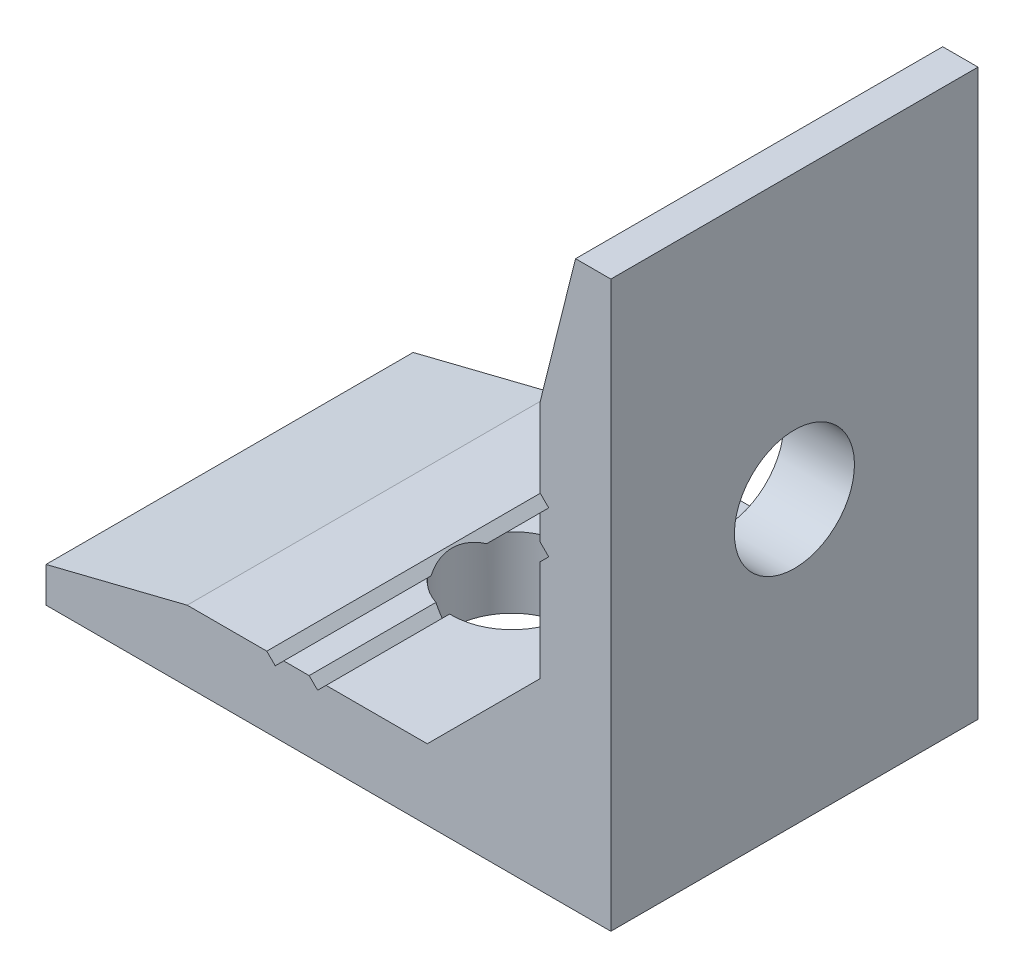
ISO-10303-21;
HEADER;
FILE_DESCRIPTION(('STEP AP214'),'2;1');
FILE_NAME('part.step','',(''),(''),'','','');
FILE_SCHEMA(('AUTOMOTIVE_DESIGN { 1 0 10303 214 1 1 1 1 }'));
ENDSEC;
DATA;
#1=APPLICATION_CONTEXT('core data for automotive mechanical design processes');
#2=APPLICATION_PROTOCOL_DEFINITION('international standard','automotive_design',2000,#1);
#3=PRODUCT_CONTEXT('',#1,'mechanical');
#4=PRODUCT('Part','Part','',(#3));
#5=PRODUCT_RELATED_PRODUCT_CATEGORY('part','',(#4));
#6=PRODUCT_DEFINITION_FORMATION('','',#4);
#7=PRODUCT_DEFINITION_CONTEXT('part definition',#1,'design');
#8=PRODUCT_DEFINITION('design','',#6,#7);
#9=PRODUCT_DEFINITION_SHAPE('','',#8);
#10=(LENGTH_UNIT() NAMED_UNIT(*) SI_UNIT(.MILLI.,.METRE.));
#11=(NAMED_UNIT(*) PLANE_ANGLE_UNIT() SI_UNIT($,.RADIAN.));
#12=(NAMED_UNIT(*) SI_UNIT($,.STERADIAN.) SOLID_ANGLE_UNIT());
#13=UNCERTAINTY_MEASURE_WITH_UNIT(LENGTH_MEASURE(1.E-05),#10,'distance_accuracy_value','');
#14=(GEOMETRIC_REPRESENTATION_CONTEXT(3) GLOBAL_UNCERTAINTY_ASSIGNED_CONTEXT((#13)) GLOBAL_UNIT_ASSIGNED_CONTEXT((#10,
#11,#12)) REPRESENTATION_CONTEXT('',''));
#15=CARTESIAN_POINT('',(0.,0.,0.));
#16=DIRECTION('',(0.,0.,1.));
#17=DIRECTION('',(1.,0.,0.));
#18=AXIS2_PLACEMENT_3D('',#15,#16,#17);
#19=CARTESIAN_POINT('',(35.599999999999,23.7649508334723,13.));
#20=DIRECTION('',(0.707106781186548,-0.707106781186548,0.));
#21=DIRECTION('',(0.707106781186548,0.707106781186548,0.));
#22=AXIS2_PLACEMENT_3D('',#19,#20,#21);
#23=PLANE('',#22);
#24=DIRECTION('',(0.,0.,-1.));
#25=VECTOR('',#24,1.);
#26=CARTESIAN_POINT('',(35.,23.1649508334733,13.));
#27=LINE('',#26,#25);
#28=CARTESIAN_POINT('',(35.0000000000001,23.1649508334733,-2.83647425895196));
#29=VERTEX_POINT('',#28);
#30=CARTESIAN_POINT('',(35.,23.1649508334733,-13.));
#31=VERTEX_POINT('',#30);
#32=EDGE_CURVE('E268',#29,#31,#27,.T.);
#33=ORIENTED_EDGE('',*,*,#32,.F.);
#34=CARTESIAN_POINT('',(31.8350491665269,20.0000000000002,0.));
#35=DIRECTION('',(0.707106781186548,-0.707106781186548,0.));
#36=DIRECTION('',(-0.707106781186548,-0.707106781186548,0.));
#37=AXIS2_PLACEMENT_3D('',#34,#35,#36);
#38=ELLIPSE('',#37,6.01040764008546,4.25);
#39=CARTESIAN_POINT('',(35.599999999999,23.7649508334723,-1.97171124192581));
#40=VERTEX_POINT('',#39);
#41=EDGE_CURVE('E546',#29,#40,#38,.T.);
#42=ORIENTED_EDGE('',*,*,#41,.T.);
#43=DIRECTION('',(0.,0.,-1.));
#44=VECTOR('',#43,1.);
#45=CARTESIAN_POINT('',(35.599999999999,23.7649508334723,13.));
#46=LINE('',#45,#44);
#47=CARTESIAN_POINT('',(35.599999999999,23.7649508334723,-13.));
#48=VERTEX_POINT('',#47);
#49=EDGE_CURVE('E272',#40,#48,#46,.T.);
#50=ORIENTED_EDGE('',*,*,#49,.T.);
#51=DIRECTION('',(-0.707106781186548,-0.707106781186548,0.));
#52=VECTOR('',#51,1.);
#53=CARTESIAN_POINT('',(35.599999999999,23.7649508334723,-13.));
#54=LINE('',#53,#52);
#55=EDGE_CURVE('E416',#48,#31,#54,.T.);
#56=ORIENTED_EDGE('',*,*,#55,.T.);
#57=EDGE_LOOP('',(#33,#42,#50,#56));
#58=FACE_BOUND('',#57,.T.);
#59=ADVANCED_FACE('F35',(#58),#23,.F.);
#60=CARTESIAN_POINT('',(34.9999999999998,21.3649508334714,13.));
#61=DIRECTION('',(1.,-1.27213054904832E-13,0.));
#62=DIRECTION('',(1.27213054904832E-13,1.,0.));
#63=AXIS2_PLACEMENT_3D('',#60,#61,#62);
#64=PLANE('',#63);
#65=CARTESIAN_POINT('',(35.,23.1649508334733,13.));
#66=VERTEX_POINT('',#65);
#67=CARTESIAN_POINT('',(35.0000000000001,23.1649508334733,2.83647425895197));
#68=VERTEX_POINT('',#67);
#69=EDGE_CURVE('E269',#66,#68,#27,.T.);
#70=ORIENTED_EDGE('',*,*,#69,.T.);
#71=CARTESIAN_POINT('',(35.,20.0000000000001,0.));
#72=DIRECTION('',(-1.,0.,0.));
#73=DIRECTION('',(0.,-1.,0.));
#74=AXIS2_PLACEMENT_3D('',#71,#72,#73);
#75=CIRCLE('',#74,4.25);
#76=CARTESIAN_POINT('',(35.0000000000001,21.3649508334712,4.0248489688691));
#77=VERTEX_POINT('',#76);
#78=EDGE_CURVE('E629',#77,#68,#75,.T.);
#79=ORIENTED_EDGE('',*,*,#78,.F.);
#80=DIRECTION('',(0.,0.,-1.));
#81=VECTOR('',#80,1.);
#82=CARTESIAN_POINT('',(34.9999999999998,21.3649508334714,13.));
#83=LINE('',#82,#81);
#84=CARTESIAN_POINT('',(34.9999999999998,21.3649508334714,13.));
#85=VERTEX_POINT('',#84);
#86=EDGE_CURVE('E265',#85,#77,#83,.T.);
#87=ORIENTED_EDGE('',*,*,#86,.F.);
#88=DIRECTION('',(-1.27213054904832E-13,-1.,0.));
#89=VECTOR('',#88,1.);
#90=CARTESIAN_POINT('',(34.9999999999998,21.3649508334714,13.));
#91=LINE('',#90,#89);
#92=EDGE_CURVE('E492',#66,#85,#91,.T.);
#93=ORIENTED_EDGE('',*,*,#92,.F.);
#94=EDGE_LOOP('',(#70,#79,#87,#93));
#95=FACE_BOUND('',#94,.T.);
#96=ADVANCED_FACE('F525',(#95),#64,.F.);
#97=CARTESIAN_POINT('',(35.5999999999993,20.7649508334723,13.));
#98=DIRECTION('',(0.707106781186345,0.70710678118675,0.));
#99=DIRECTION('',(-0.70710678118675,0.707106781186345,0.));
#100=AXIS2_PLACEMENT_3D('',#97,#98,#99);
#101=PLANE('',#100);
#102=ORIENTED_EDGE('',*,*,#86,.T.);
#103=CARTESIAN_POINT('',(36.364950833472,20.,0.));
#104=DIRECTION('',(0.707106781186345,0.70710678118675,0.));
#105=DIRECTION('',(-0.70710678118675,0.707106781186345,0.));
#106=AXIS2_PLACEMENT_3D('',#103,#104,#105);
#107=ELLIPSE('',#106,6.01040764008757,4.25);
#108=CARTESIAN_POINT('',(35.5999999999993,20.7649508334723,4.18059208992819));
#109=VERTEX_POINT('',#108);
#110=EDGE_CURVE('E250',#77,#109,#107,.T.);
#111=ORIENTED_EDGE('',*,*,#110,.T.);
#112=DIRECTION('',(0.,0.,-1.));
#113=VECTOR('',#112,1.);
#114=CARTESIAN_POINT('',(35.5999999999993,20.7649508334723,13.));
#115=LINE('',#114,#113);
#116=CARTESIAN_POINT('',(35.5999999999993,20.7649508334723,13.));
#117=VERTEX_POINT('',#116);
#118=EDGE_CURVE('E249',#117,#109,#115,.T.);
#119=ORIENTED_EDGE('',*,*,#118,.F.);
#120=DIRECTION('',(0.70710678118675,-0.707106781186345,0.));
#121=VECTOR('',#120,1.);
#122=CARTESIAN_POINT('',(35.5999999999993,20.7649508334723,13.));
#123=LINE('',#122,#121);
#124=EDGE_CURVE('E494',#85,#117,#123,.T.);
#125=ORIENTED_EDGE('',*,*,#124,.F.);
#126=EDGE_LOOP('',(#102,#111,#119,#125));
#127=FACE_BOUND('',#126,.T.);
#128=ADVANCED_FACE('F531',(#127),#101,.F.);
#129=CARTESIAN_POINT('',(35.5999999999993,20.7649508334723,13.));
#130=DIRECTION('',(0.707106781186615,-0.70710678118648,0.));
#131=DIRECTION('',(0.70710678118648,0.707106781186615,0.));
#132=AXIS2_PLACEMENT_3D('',#129,#130,#131);
#133=PLANE('',#132);
#134=DIRECTION('',(0.,0.,-1.));
#135=VECTOR('',#134,1.);
#136=CARTESIAN_POINT('',(35.,20.164950833473,13.));
#137=LINE('',#136,#135);
#138=CARTESIAN_POINT('',(35.,20.164950833473,-4.24679776096491));
#139=VERTEX_POINT('',#138);
#140=CARTESIAN_POINT('',(35.,20.164950833473,-13.));
#141=VERTEX_POINT('',#140);
#142=EDGE_CURVE('E257',#139,#141,#137,.T.);
#143=ORIENTED_EDGE('',*,*,#142,.F.);
#144=CARTESIAN_POINT('',(34.8350491665272,20.0000000000001,0.));
#145=DIRECTION('',(0.707106781186615,-0.70710678118648,0.));
#146=DIRECTION('',(-0.70710678118648,-0.707106781186615,0.));
#147=AXIS2_PLACEMENT_3D('',#144,#145,#146);
#148=ELLIPSE('',#147,6.01040764008489,4.25);
#149=CARTESIAN_POINT('',(35.5999999999993,20.7649508334723,-4.18059208992818));
#150=VERTEX_POINT('',#149);
#151=EDGE_CURVE('E50',#139,#150,#148,.T.);
#152=ORIENTED_EDGE('',*,*,#151,.T.);
#153=CARTESIAN_POINT('',(35.5999999999993,20.7649508334723,-13.));
#154=VERTEX_POINT('',#153);
#155=EDGE_CURVE('E256',#150,#154,#115,.T.);
#156=ORIENTED_EDGE('',*,*,#155,.T.);
#157=DIRECTION('',(-0.70710678118648,-0.707106781186615,0.));
#158=VECTOR('',#157,1.);
#159=CARTESIAN_POINT('',(35.5999999999993,20.7649508334723,-13.));
#160=LINE('',#159,#158);
#161=EDGE_CURVE('E356',#154,#141,#160,.T.);
#162=ORIENTED_EDGE('',*,*,#161,.T.);
#163=EDGE_LOOP('',(#143,#152,#156,#162));
#164=FACE_BOUND('',#163,.T.);
#165=ADVANCED_FACE('F426',(#164),#133,.F.);
#166=CARTESIAN_POINT('',(19.2350491665275,4.39999999999998,13.));
#167=DIRECTION('',(0.707106781186479,-0.707106781186616,0.));
#168=DIRECTION('',(0.707106781186616,0.707106781186479,0.));
#169=AXIS2_PLACEMENT_3D('',#166,#167,#168);
#170=PLANE('',#169);
#171=DIRECTION('',(0.,0.,-1.));
#172=VECTOR('',#171,1.);
#173=CARTESIAN_POINT('',(19.8350491665276,5.,13.));
#174=LINE('',#173,#172);
#175=CARTESIAN_POINT('',(19.8350491665276,5.,13.));
#176=VERTEX_POINT('',#175);
#177=CARTESIAN_POINT('',(19.8350491665276,5.,4.24679776096494));
#178=VERTEX_POINT('',#177);
#179=EDGE_CURVE('E329',#176,#178,#174,.T.);
#180=ORIENTED_EDGE('',*,*,#179,.T.);
#181=CARTESIAN_POINT('',(20.,5.16495083347237,0.));
#182=DIRECTION('',(0.707106781186479,-0.707106781186616,0.));
#183=DIRECTION('',(0.707106781186616,0.707106781186479,0.));
#184=AXIS2_PLACEMENT_3D('',#181,#182,#183);
#185=ELLIPSE('',#184,6.01040764008507,4.25);
#186=CARTESIAN_POINT('',(19.2350491665275,4.39999999999998,4.18059208992814));
#187=VERTEX_POINT('',#186);
#188=EDGE_CURVE('E402',#178,#187,#185,.T.);
#189=ORIENTED_EDGE('',*,*,#188,.T.);
#190=DIRECTION('',(0.,0.,-1.));
#191=VECTOR('',#190,1.);
#192=CARTESIAN_POINT('',(19.2350491665275,4.39999999999998,13.));
#193=LINE('',#192,#191);
#194=CARTESIAN_POINT('',(19.2350491665275,4.39999999999998,13.));
#195=VERTEX_POINT('',#194);
#196=EDGE_CURVE('E325',#195,#187,#193,.T.);
#197=ORIENTED_EDGE('',*,*,#196,.F.);
#198=DIRECTION('',(-0.707106781186616,-0.707106781186479,0.));
#199=VECTOR('',#198,1.);
#200=CARTESIAN_POINT('',(19.2350491665275,4.39999999999998,13.));
#201=LINE('',#200,#199);
#202=EDGE_CURVE('E502',#176,#195,#201,.T.);
#203=ORIENTED_EDGE('',*,*,#202,.F.);
#204=EDGE_LOOP('',(#180,#189,#197,#203));
#205=FACE_BOUND('',#204,.T.);
#206=ADVANCED_FACE('F599',(#205),#170,.F.);
#207=CARTESIAN_POINT('',(19.2350491665275,4.39999999999998,13.));
#208=DIRECTION('',(-0.707106781186481,-0.707106781186614,0.));
#209=DIRECTION('',(0.707106781186614,-0.707106781186481,0.));
#210=AXIS2_PLACEMENT_3D('',#207,#208,#209);
#211=PLANE('',#210);
#212=DIRECTION('',(0.,0.,-1.));
#213=VECTOR('',#212,1.);
#214=CARTESIAN_POINT('',(18.6350491665274,5.,13.));
#215=LINE('',#214,#213);
#216=CARTESIAN_POINT('',(18.6350491665274,5.,-4.02484896886855));
#217=VERTEX_POINT('',#216);
#218=CARTESIAN_POINT('',(18.6350491665274,5.,-13.));
#219=VERTEX_POINT('',#218);
#220=EDGE_CURVE('E320',#217,#219,#215,.T.);
#221=ORIENTED_EDGE('',*,*,#220,.F.);
#222=CARTESIAN_POINT('',(20.,3.63504916652758,0.));
#223=DIRECTION('',(-0.707106781186481,-0.707106781186614,0.));
#224=DIRECTION('',(-0.707106781186614,0.707106781186481,0.));
#225=AXIS2_PLACEMENT_3D('',#222,#223,#224);
#226=ELLIPSE('',#225,6.01040764008509,4.25);
#227=CARTESIAN_POINT('',(19.2350491665275,4.39999999999998,-4.18059208992813));
#228=VERTEX_POINT('',#227);
#229=EDGE_CURVE('E400',#217,#228,#226,.T.);
#230=ORIENTED_EDGE('',*,*,#229,.T.);
#231=CARTESIAN_POINT('',(19.2350491665275,4.39999999999998,-13.));
#232=VERTEX_POINT('',#231);
#233=EDGE_CURVE('E324',#228,#232,#193,.T.);
#234=ORIENTED_EDGE('',*,*,#233,.T.);
#235=DIRECTION('',(-0.707106781186614,0.707106781186481,0.));
#236=VECTOR('',#235,1.);
#237=CARTESIAN_POINT('',(19.2350491665275,4.39999999999998,-13.));
#238=LINE('',#237,#236);
#239=EDGE_CURVE('E362',#232,#219,#238,.T.);
#240=ORIENTED_EDGE('',*,*,#239,.T.);
#241=EDGE_LOOP('',(#221,#230,#234,#240));
#242=FACE_BOUND('',#241,.T.);
#243=ADVANCED_FACE('F568',(#242),#211,.F.);
#244=CARTESIAN_POINT('',(16.8350491665274,5.,13.));
#245=DIRECTION('',(0.,-1.,0.));
#246=DIRECTION('',(0.,0.,-1.));
#247=AXIS2_PLACEMENT_3D('',#244,#245,#246);
#248=PLANE('',#247);
#249=CARTESIAN_POINT('',(18.6350491665274,5.,13.));
#250=VERTEX_POINT('',#249);
#251=CARTESIAN_POINT('',(18.6350491665274,5.,4.02484896886856));
#252=VERTEX_POINT('',#251);
#253=EDGE_CURVE('E321',#250,#252,#215,.T.);
#254=ORIENTED_EDGE('',*,*,#253,.T.);
#255=CARTESIAN_POINT('',(20.,5.,0.));
#256=DIRECTION('',(0.,1.,0.));
#257=DIRECTION('',(0.,0.,1.));
#258=AXIS2_PLACEMENT_3D('',#255,#256,#257);
#259=CIRCLE('',#258,4.25);
#260=CARTESIAN_POINT('',(16.8350491665274,5.,2.83647425895264));
#261=VERTEX_POINT('',#260);
#262=EDGE_CURVE('E557',#261,#252,#259,.T.);
#263=ORIENTED_EDGE('',*,*,#262,.F.);
#264=DIRECTION('',(0.,0.,-1.));
#265=VECTOR('',#264,1.);
#266=CARTESIAN_POINT('',(16.8350491665274,5.,13.));
#267=LINE('',#266,#265);
#268=CARTESIAN_POINT('',(16.8350491665274,5.,13.));
#269=VERTEX_POINT('',#268);
#270=EDGE_CURVE('E317',#269,#261,#267,.T.);
#271=ORIENTED_EDGE('',*,*,#270,.F.);
#272=DIRECTION('',(-1.,0.,0.));
#273=VECTOR('',#272,1.);
#274=CARTESIAN_POINT('',(16.8350491665274,5.,13.));
#275=LINE('',#274,#273);
#276=EDGE_CURVE('E506',#250,#269,#275,.T.);
#277=ORIENTED_EDGE('',*,*,#276,.F.);
#278=EDGE_LOOP('',(#254,#263,#271,#277));
#279=FACE_BOUND('',#278,.T.);
#280=ADVANCED_FACE('F580',(#279),#248,.F.);
#281=CARTESIAN_POINT('',(16.2350491665275,4.39999999999998,13.));
#282=DIRECTION('',(0.707106781186614,-0.707106781186481,0.));
#283=DIRECTION('',(0.707106781186481,0.707106781186614,0.));
#284=AXIS2_PLACEMENT_3D('',#281,#282,#283);
#285=PLANE('',#284);
#286=ORIENTED_EDGE('',*,*,#270,.T.);
#287=CARTESIAN_POINT('',(20.,8.16495083347323,0.));
#288=DIRECTION('',(0.707106781186614,-0.707106781186481,0.));
#289=DIRECTION('',(0.707106781186481,0.707106781186614,0.));
#290=AXIS2_PLACEMENT_3D('',#287,#288,#289);
#291=ELLIPSE('',#290,6.01040764008622,4.25);
#292=CARTESIAN_POINT('',(16.2350491665275,4.39999999999998,1.97171124192527));
#293=VERTEX_POINT('',#292);
#294=EDGE_CURVE('E558',#261,#293,#291,.T.);
#295=ORIENTED_EDGE('',*,*,#294,.T.);
#296=DIRECTION('',(0.,0.,-1.));
#297=VECTOR('',#296,1.);
#298=CARTESIAN_POINT('',(16.2350491665275,4.39999999999998,13.));
#299=LINE('',#298,#297);
#300=CARTESIAN_POINT('',(16.2350491665275,4.39999999999998,13.));
#301=VERTEX_POINT('',#300);
#302=EDGE_CURVE('E301',#301,#293,#299,.T.);
#303=ORIENTED_EDGE('',*,*,#302,.F.);
#304=DIRECTION('',(-0.707106781186481,-0.707106781186614,0.));
#305=VECTOR('',#304,1.);
#306=CARTESIAN_POINT('',(16.2350491665275,4.39999999999998,13.));
#307=LINE('',#306,#305);
#308=EDGE_CURVE('E508',#269,#301,#307,.T.);
#309=ORIENTED_EDGE('',*,*,#308,.F.);
#310=EDGE_LOOP('',(#286,#295,#303,#309));
#311=FACE_BOUND('',#310,.T.);
#312=ADVANCED_FACE('F584',(#311),#285,.F.);
#313=CARTESIAN_POINT('',(0.,2.5,13.));
#314=DIRECTION('',(1.,0.,0.));
#315=DIRECTION('',(0.,0.,-1.));
#316=AXIS2_PLACEMENT_3D('',#313,#314,#315);
#317=PLANE('',#316);
#318=DIRECTION('',(0.,-1.,0.));
#319=VECTOR('',#318,1.);
#320=CARTESIAN_POINT('',(0.,2.5,-13.));
#321=LINE('',#320,#319);
#322=CARTESIAN_POINT('',(0.,2.5,-13.));
#323=VERTEX_POINT('',#322);
#324=CARTESIAN_POINT('',(0.,0.,-13.));
#325=VERTEX_POINT('',#324);
#326=EDGE_CURVE('E390',#323,#325,#321,.T.);
#327=ORIENTED_EDGE('',*,*,#326,.T.);
#328=DIRECTION('',(0.,0.,-1.));
#329=VECTOR('',#328,1.);
#330=CARTESIAN_POINT('',(0.,0.,13.));
#331=LINE('',#330,#329);
#332=CARTESIAN_POINT('',(0.,0.,13.));
#333=VERTEX_POINT('',#332);
#334=EDGE_CURVE('E291',#333,#325,#331,.T.);
#335=ORIENTED_EDGE('',*,*,#334,.F.);
#336=DIRECTION('',(0.,-1.,0.));
#337=VECTOR('',#336,1.);
#338=CARTESIAN_POINT('',(0.,2.5,13.));
#339=LINE('',#338,#337);
#340=CARTESIAN_POINT('',(0.,2.5,13.));
#341=VERTEX_POINT('',#340);
#342=EDGE_CURVE('E375',#341,#333,#339,.T.);
#343=ORIENTED_EDGE('',*,*,#342,.F.);
#344=DIRECTION('',(0.,0.,-1.));
#345=VECTOR('',#344,1.);
#346=CARTESIAN_POINT('',(0.,2.5,13.));
#347=LINE('',#346,#345);
#348=EDGE_CURVE('E376',#341,#323,#347,.T.);
#349=ORIENTED_EDGE('',*,*,#348,.T.);
#350=EDGE_LOOP('',(#327,#335,#343,#349));
#351=FACE_BOUND('',#350,.T.);
#352=ADVANCED_FACE('F37',(#351),#317,.F.);
#353=CARTESIAN_POINT('',(0.,0.,13.));
#354=DIRECTION('',(0.,1.,0.));
#355=DIRECTION('',(0.,0.,1.));
#356=AXIS2_PLACEMENT_3D('',#353,#354,#355);
#357=PLANE('',#356);
#358=CARTESIAN_POINT('',(20.,0.,0.));
#359=DIRECTION('',(0.,1.,0.));
#360=DIRECTION('',(0.,0.,1.));
#361=AXIS2_PLACEMENT_3D('',#358,#359,#360);
#362=CIRCLE('',#361,4.25);
#363=CARTESIAN_POINT('',(20.,0.,4.25000000000001));
#364=VERTEX_POINT('',#363);
#365=EDGE_CURVE('E552',#364,#364,#362,.T.);
#366=ORIENTED_EDGE('',*,*,#365,.T.);
#367=EDGE_LOOP('',(#366));
#368=FACE_BOUND('',#367,.T.);
#369=DIRECTION('',(1.,0.,0.));
#370=VECTOR('',#369,1.);
#371=CARTESIAN_POINT('',(0.,0.,-13.));
#372=LINE('',#371,#370);
#373=CARTESIAN_POINT('',(40.,0.,-13.));
#374=VERTEX_POINT('',#373);
#375=EDGE_CURVE('E392',#325,#374,#372,.T.);
#376=ORIENTED_EDGE('',*,*,#375,.T.);
#377=DIRECTION('',(0.,0.,-1.));
#378=VECTOR('',#377,1.);
#379=CARTESIAN_POINT('',(40.,0.,13.));
#380=LINE('',#379,#378);
#381=CARTESIAN_POINT('',(40.,0.,13.));
#382=VERTEX_POINT('',#381);
#383=EDGE_CURVE('E288',#382,#374,#380,.T.);
#384=ORIENTED_EDGE('',*,*,#383,.F.);
#385=DIRECTION('',(1.,0.,0.));
#386=VECTOR('',#385,1.);
#387=CARTESIAN_POINT('',(0.,0.,13.));
#388=LINE('',#387,#386);
#389=EDGE_CURVE('E477',#333,#382,#388,.T.);
#390=ORIENTED_EDGE('',*,*,#389,.F.);
#391=ORIENTED_EDGE('',*,*,#334,.T.);
#392=EDGE_LOOP('',(#376,#384,#390,#391));
#393=FACE_BOUND('',#392,.T.);
#394=ADVANCED_FACE('F476',(#368,#393),#357,.F.);
#395=CARTESIAN_POINT('',(40.,0.,13.));
#396=DIRECTION('',(-1.,0.,0.));
#397=DIRECTION('',(0.,0.,1.));
#398=AXIS2_PLACEMENT_3D('',#395,#396,#397);
#399=PLANE('',#398);
#400=CARTESIAN_POINT('',(40.0000000000007,19.9999999999999,0.));
#401=DIRECTION('',(-1.,0.,0.));
#402=DIRECTION('',(0.,-1.,0.));
#403=AXIS2_PLACEMENT_3D('',#400,#401,#402);
#404=CIRCLE('',#403,4.25);
#405=CARTESIAN_POINT('',(40.0000000000005,15.7499999999999,0.));
#406=VERTEX_POINT('',#405);
#407=EDGE_CURVE('E251',#406,#406,#404,.T.);
#408=ORIENTED_EDGE('',*,*,#407,.T.);
#409=EDGE_LOOP('',(#408));
#410=FACE_BOUND('',#409,.T.);
#411=DIRECTION('',(0.,1.,0.));
#412=VECTOR('',#411,1.);
#413=CARTESIAN_POINT('',(40.,0.,-13.));
#414=LINE('',#413,#412);
#415=CARTESIAN_POINT('',(40.,40.,-13.));
#416=VERTEX_POINT('',#415);
#417=EDGE_CURVE('E397',#374,#416,#414,.T.);
#418=ORIENTED_EDGE('',*,*,#417,.T.);
#419=DIRECTION('',(0.,0.,-1.));
#420=VECTOR('',#419,1.);
#421=CARTESIAN_POINT('',(40.,40.,13.));
#422=LINE('',#421,#420);
#423=CARTESIAN_POINT('',(40.,40.,13.));
#424=VERTEX_POINT('',#423);
#425=EDGE_CURVE('E285',#424,#416,#422,.T.);
#426=ORIENTED_EDGE('',*,*,#425,.F.);
#427=DIRECTION('',(0.,1.,0.));
#428=VECTOR('',#427,1.);
#429=CARTESIAN_POINT('',(40.,0.,13.));
#430=LINE('',#429,#428);
#431=EDGE_CURVE('E473',#382,#424,#430,.T.);
#432=ORIENTED_EDGE('',*,*,#431,.F.);
#433=ORIENTED_EDGE('',*,*,#383,.T.);
#434=EDGE_LOOP('',(#418,#426,#432,#433));
#435=FACE_BOUND('',#434,.T.);
#436=ADVANCED_FACE('F472',(#410,#435),#399,.F.);
#437=CARTESIAN_POINT('',(37.5,40.,13.));
#438=DIRECTION('',(0.,-1.,0.));
#439=DIRECTION('',(0.,0.,-1.));
#440=AXIS2_PLACEMENT_3D('',#437,#438,#439);
#441=PLANE('',#440);
#442=DIRECTION('',(-1.,0.,0.));
#443=VECTOR('',#442,1.);
#444=CARTESIAN_POINT('',(37.5,40.,-13.));
#445=LINE('',#444,#443);
#446=CARTESIAN_POINT('',(37.5,40.,-13.));
#447=VERTEX_POINT('',#446);
#448=EDGE_CURVE('E407',#416,#447,#445,.T.);
#449=ORIENTED_EDGE('',*,*,#448,.T.);
#450=DIRECTION('',(0.,0.,-1.));
#451=VECTOR('',#450,1.);
#452=CARTESIAN_POINT('',(37.5,40.,13.));
#453=LINE('',#452,#451);
#454=CARTESIAN_POINT('',(37.5,40.,13.));
#455=VERTEX_POINT('',#454);
#456=EDGE_CURVE('E282',#455,#447,#453,.T.);
#457=ORIENTED_EDGE('',*,*,#456,.F.);
#458=DIRECTION('',(-1.,0.,0.));
#459=VECTOR('',#458,1.);
#460=CARTESIAN_POINT('',(37.5,40.,13.));
#461=LINE('',#460,#459);
#462=EDGE_CURVE('E469',#424,#455,#461,.T.);
#463=ORIENTED_EDGE('',*,*,#462,.F.);
#464=ORIENTED_EDGE('',*,*,#425,.T.);
#465=EDGE_LOOP('',(#449,#457,#463,#464));
#466=FACE_BOUND('',#465,.T.);
#467=ADVANCED_FACE('F466',(#466),#441,.F.);
#468=CARTESIAN_POINT('',(37.5,40.,13.));
#469=DIRECTION('',(0.970142500145332,-0.242535625036332,0.));
#470=DIRECTION('',(0.242535625036332,0.970142500145332,0.));
#471=AXIS2_PLACEMENT_3D('',#468,#469,#470);
#472=PLANE('',#471);
#473=DIRECTION('',(-0.242535625036332,-0.970142500145332,0.));
#474=VECTOR('',#473,1.);
#475=CARTESIAN_POINT('',(37.5,40.,-13.));
#476=LINE('',#475,#474);
#477=CARTESIAN_POINT('',(35.,30.,-13.));
#478=VERTEX_POINT('',#477);
#479=EDGE_CURVE('E409',#447,#478,#476,.T.);
#480=ORIENTED_EDGE('',*,*,#479,.T.);
#481=DIRECTION('',(0.,0.,-1.));
#482=VECTOR('',#481,1.);
#483=CARTESIAN_POINT('',(35.,30.,13.));
#484=LINE('',#483,#482);
#485=CARTESIAN_POINT('',(35.,30.,13.));
#486=VERTEX_POINT('',#485);
#487=EDGE_CURVE('E279',#486,#478,#484,.T.);
#488=ORIENTED_EDGE('',*,*,#487,.F.);
#489=DIRECTION('',(-0.242535625036332,-0.970142500145332,0.));
#490=VECTOR('',#489,1.);
#491=CARTESIAN_POINT('',(37.5,40.,13.));
#492=LINE('',#491,#490);
#493=EDGE_CURVE('E462',#455,#486,#492,.T.);
#494=ORIENTED_EDGE('',*,*,#493,.F.);
#495=ORIENTED_EDGE('',*,*,#456,.T.);
#496=EDGE_LOOP('',(#480,#488,#494,#495));
#497=FACE_BOUND('',#496,.T.);
#498=ADVANCED_FACE('F461',(#497),#472,.F.);
#499=CARTESIAN_POINT('',(35.,24.3649508334714,13.));
#500=DIRECTION('',(1.,0.,0.));
#501=DIRECTION('',(0.,0.,-1.));
#502=AXIS2_PLACEMENT_3D('',#499,#500,#501);
#503=PLANE('',#502);
#504=DIRECTION('',(0.,-1.,0.));
#505=VECTOR('',#504,1.);
#506=CARTESIAN_POINT('',(35.,24.3649508334714,-13.));
#507=LINE('',#506,#505);
#508=CARTESIAN_POINT('',(35.,24.3649508334714,-13.));
#509=VERTEX_POINT('',#508);
#510=EDGE_CURVE('E411',#478,#509,#507,.T.);
#511=ORIENTED_EDGE('',*,*,#510,.T.);
#512=DIRECTION('',(0.,0.,-1.));
#513=VECTOR('',#512,1.);
#514=CARTESIAN_POINT('',(35.,24.3649508334714,13.));
#515=LINE('',#514,#513);
#516=CARTESIAN_POINT('',(35.,24.3649508334714,13.));
#517=VERTEX_POINT('',#516);
#518=EDGE_CURVE('E276',#517,#509,#515,.T.);
#519=ORIENTED_EDGE('',*,*,#518,.F.);
#520=DIRECTION('',(0.,-1.,0.));
#521=VECTOR('',#520,1.);
#522=CARTESIAN_POINT('',(35.,24.3649508334714,13.));
#523=LINE('',#522,#521);
#524=EDGE_CURVE('E457',#486,#517,#523,.T.);
#525=ORIENTED_EDGE('',*,*,#524,.F.);
#526=ORIENTED_EDGE('',*,*,#487,.T.);
#527=EDGE_LOOP('',(#511,#519,#525,#526));
#528=FACE_BOUND('',#527,.T.);
#529=ADVANCED_FACE('F456',(#528),#503,.F.);
#530=CARTESIAN_POINT('',(35.599999999999,23.7649508334723,13.));
#531=DIRECTION('',(0.707106781186617,0.707106781186478,0.));
#532=DIRECTION('',(-0.707106781186478,0.707106781186617,0.));
#533=AXIS2_PLACEMENT_3D('',#530,#531,#532);
#534=PLANE('',#533);
#535=ORIENTED_EDGE('',*,*,#49,.F.);
#536=CARTESIAN_POINT('',(39.3649508334707,19.9999999999999,0.));
#537=DIRECTION('',(0.707106781186617,0.707106781186478,0.));
#538=DIRECTION('',(-0.707106781186478,0.707106781186617,0.));
#539=AXIS2_PLACEMENT_3D('',#536,#537,#538);
#540=ELLIPSE('',#539,6.01040764008526,4.25);
#541=CARTESIAN_POINT('',(35.599999999999,23.7649508334723,1.97171124192582));
#542=VERTEX_POINT('',#541);
#543=EDGE_CURVE('E545',#40,#542,#540,.T.);
#544=ORIENTED_EDGE('',*,*,#543,.T.);
#545=CARTESIAN_POINT('',(35.599999999999,23.7649508334723,13.));
#546=VERTEX_POINT('',#545);
#547=EDGE_CURVE('E273',#546,#542,#46,.T.);
#548=ORIENTED_EDGE('',*,*,#547,.F.);
#549=DIRECTION('',(0.707106781186478,-0.707106781186617,0.));
#550=VECTOR('',#549,1.);
#551=CARTESIAN_POINT('',(35.599999999999,23.7649508334723,13.));
#552=LINE('',#551,#550);
#553=EDGE_CURVE('E453',#517,#546,#552,.T.);
#554=ORIENTED_EDGE('',*,*,#553,.F.);
#555=ORIENTED_EDGE('',*,*,#518,.T.);
#556=DIRECTION('',(0.707106781186478,-0.707106781186617,0.));
#557=VECTOR('',#556,1.);
#558=CARTESIAN_POINT('',(35.599999999999,23.7649508334723,-13.));
#559=LINE('',#558,#557);
#560=EDGE_CURVE('E413',#509,#48,#559,.T.);
#561=ORIENTED_EDGE('',*,*,#560,.T.);
#562=EDGE_LOOP('',(#535,#544,#548,#554,#555,#561));
#563=FACE_BOUND('',#562,.T.);
#564=ADVANCED_FACE('F448',(#563),#534,.F.);
#565=ORIENTED_EDGE('',*,*,#547,.T.);
#566=EDGE_CURVE('E544',#542,#68,#38,.T.);
#567=ORIENTED_EDGE('',*,*,#566,.T.);
#568=ORIENTED_EDGE('',*,*,#69,.F.);
#569=DIRECTION('',(-0.707106781186548,-0.707106781186548,0.));
#570=VECTOR('',#569,1.);
#571=CARTESIAN_POINT('',(35.599999999999,23.7649508334723,13.));
#572=LINE('',#571,#570);
#573=EDGE_CURVE('E490',#546,#66,#572,.T.);
#574=ORIENTED_EDGE('',*,*,#573,.F.);
#575=EDGE_LOOP('',(#565,#567,#568,#574));
#576=FACE_BOUND('',#575,.T.);
#577=ADVANCED_FACE('F527',(#576),#23,.F.);
#578=CARTESIAN_POINT('',(35.0000000000001,21.3649508334712,-4.02484896886909));
#579=VERTEX_POINT('',#578);
#580=CARTESIAN_POINT('',(34.9999999999998,21.3649508334714,-13.));
#581=VERTEX_POINT('',#580);
#582=EDGE_CURVE('E264',#579,#581,#83,.T.);
#583=ORIENTED_EDGE('',*,*,#582,.F.);
#584=EDGE_CURVE('E440',#29,#579,#75,.T.);
#585=ORIENTED_EDGE('',*,*,#584,.F.);
#586=ORIENTED_EDGE('',*,*,#32,.T.);
#587=DIRECTION('',(-1.27213054904832E-13,-1.,0.));
#588=VECTOR('',#587,1.);
#589=CARTESIAN_POINT('',(34.9999999999998,21.3649508334714,-13.));
#590=LINE('',#589,#588);
#591=EDGE_CURVE('E419',#31,#581,#590,.T.);
#592=ORIENTED_EDGE('',*,*,#591,.T.);
#593=EDGE_LOOP('',(#583,#585,#586,#592));
#594=FACE_BOUND('',#593,.T.);
#595=ADVANCED_FACE('F438',(#594),#64,.F.);
#596=ORIENTED_EDGE('',*,*,#155,.F.);
#597=EDGE_CURVE('E435',#150,#579,#107,.T.);
#598=ORIENTED_EDGE('',*,*,#597,.T.);
#599=ORIENTED_EDGE('',*,*,#582,.T.);
#600=DIRECTION('',(0.70710678118675,-0.707106781186345,0.));
#601=VECTOR('',#600,1.);
#602=CARTESIAN_POINT('',(35.5999999999993,20.7649508334723,-13.));
#603=LINE('',#602,#601);
#604=EDGE_CURVE('E422',#581,#154,#603,.T.);
#605=ORIENTED_EDGE('',*,*,#604,.T.);
#606=EDGE_LOOP('',(#596,#598,#599,#605));
#607=FACE_BOUND('',#606,.T.);
#608=ADVANCED_FACE('F432',(#607),#101,.F.);
#609=ORIENTED_EDGE('',*,*,#118,.T.);
#610=CARTESIAN_POINT('',(35.,20.164950833473,4.24679776096492));
#611=VERTEX_POINT('',#610);
#612=EDGE_CURVE('E236',#109,#611,#148,.T.);
#613=ORIENTED_EDGE('',*,*,#612,.T.);
#614=CARTESIAN_POINT('',(35.,20.164950833473,13.));
#615=VERTEX_POINT('',#614);
#616=EDGE_CURVE('E246',#615,#611,#137,.T.);
#617=ORIENTED_EDGE('',*,*,#616,.F.);
#618=DIRECTION('',(-0.70710678118648,-0.707106781186615,0.));
#619=VECTOR('',#618,1.);
#620=CARTESIAN_POINT('',(35.5999999999993,20.7649508334723,13.));
#621=LINE('',#620,#619);
#622=EDGE_CURVE('E496',#117,#615,#621,.T.);
#623=ORIENTED_EDGE('',*,*,#622,.F.);
#624=EDGE_LOOP('',(#609,#613,#617,#623));
#625=FACE_BOUND('',#624,.T.);
#626=ADVANCED_FACE('F244',(#625),#133,.F.);
#627=CARTESIAN_POINT('',(34.9999999999998,12.9999999999999,13.));
#628=DIRECTION('',(1.,0.,0.));
#629=DIRECTION('',(0.,1.,0.));
#630=AXIS2_PLACEMENT_3D('',#627,#628,#629);
#631=PLANE('',#630);
#632=ORIENTED_EDGE('',*,*,#616,.T.);
#633=CARTESIAN_POINT('',(35.,20.0000000000001,0.));
#634=DIRECTION('',(1.,0.,0.));
#635=DIRECTION('',(0.,1.,0.));
#636=AXIS2_PLACEMENT_3D('',#633,#634,#635);
#637=CIRCLE('',#636,4.25);
#638=EDGE_CURVE('E11',#611,#139,#637,.T.);
#639=ORIENTED_EDGE('',*,*,#638,.T.);
#640=ORIENTED_EDGE('',*,*,#142,.T.);
#641=DIRECTION('',(0.,-1.,0.));
#642=VECTOR('',#641,1.);
#643=CARTESIAN_POINT('',(34.9999999999998,12.9999999999999,-13.));
#644=LINE('',#643,#642);
#645=CARTESIAN_POINT('',(34.9999999999998,12.9999999999999,-13.));
#646=VERTEX_POINT('',#645);
#647=EDGE_CURVE('E350',#141,#646,#644,.T.);
#648=ORIENTED_EDGE('',*,*,#647,.T.);
#649=DIRECTION('',(0.,0.,-1.));
#650=VECTOR('',#649,1.);
#651=CARTESIAN_POINT('',(34.9999999999998,12.9999999999999,13.));
#652=LINE('',#651,#650);
#653=CARTESIAN_POINT('',(34.9999999999998,12.9999999999999,13.));
#654=VERTEX_POINT('',#653);
#655=EDGE_CURVE('E260',#654,#646,#652,.T.);
#656=ORIENTED_EDGE('',*,*,#655,.F.);
#657=DIRECTION('',(0.,-1.,0.));
#658=VECTOR('',#657,1.);
#659=CARTESIAN_POINT('',(34.9999999999998,12.9999999999999,13.));
#660=LINE('',#659,#658);
#661=EDGE_CURVE('E255',#615,#654,#660,.T.);
#662=ORIENTED_EDGE('',*,*,#661,.F.);
#663=EDGE_LOOP('',(#632,#639,#640,#648,#656,#662));
#664=FACE_BOUND('',#663,.T.);
#665=ADVANCED_FACE('F253',(#664),#631,.F.);
#666=CARTESIAN_POINT('',(27.,5.,13.));
#667=DIRECTION('',(0.707106781186552,-0.707106781186543,0.));
#668=DIRECTION('',(0.707106781186543,0.707106781186552,0.));
#669=AXIS2_PLACEMENT_3D('',#666,#667,#668);
#670=PLANE('',#669);
#671=DIRECTION('',(-0.707106781186543,-0.707106781186552,0.));
#672=VECTOR('',#671,1.);
#673=CARTESIAN_POINT('',(27.,5.,-13.));
#674=LINE('',#673,#672);
#675=CARTESIAN_POINT('',(27.,5.,-13.));
#676=VERTEX_POINT('',#675);
#677=EDGE_CURVE('E343',#646,#676,#674,.T.);
#678=ORIENTED_EDGE('',*,*,#677,.T.);
#679=DIRECTION('',(0.,0.,-1.));
#680=VECTOR('',#679,1.);
#681=CARTESIAN_POINT('',(27.,5.,13.));
#682=LINE('',#681,#680);
#683=CARTESIAN_POINT('',(27.,5.,13.));
#684=VERTEX_POINT('',#683);
#685=EDGE_CURVE('E331',#684,#676,#682,.T.);
#686=ORIENTED_EDGE('',*,*,#685,.F.);
#687=DIRECTION('',(-0.707106781186543,-0.707106781186552,0.));
#688=VECTOR('',#687,1.);
#689=CARTESIAN_POINT('',(27.,5.,13.));
#690=LINE('',#689,#688);
#691=EDGE_CURVE('E344',#654,#684,#690,.T.);
#692=ORIENTED_EDGE('',*,*,#691,.F.);
#693=ORIENTED_EDGE('',*,*,#655,.T.);
#694=EDGE_LOOP('',(#678,#686,#692,#693));
#695=FACE_BOUND('',#694,.T.);
#696=ADVANCED_FACE('F342',(#695),#670,.F.);
#697=CARTESIAN_POINT('',(19.8350491665276,5.,13.));
#698=DIRECTION('',(0.,-1.,0.));
#699=DIRECTION('',(0.,0.,-1.));
#700=AXIS2_PLACEMENT_3D('',#697,#698,#699);
#701=PLANE('',#700);
#702=CARTESIAN_POINT('',(19.8350491665276,5.,-4.24679776096493));
#703=VERTEX_POINT('',#702);
#704=CARTESIAN_POINT('',(19.8350491665276,5.,-13.));
#705=VERTEX_POINT('',#704);
#706=EDGE_CURVE('E328',#703,#705,#174,.T.);
#707=ORIENTED_EDGE('',*,*,#706,.F.);
#708=EDGE_CURVE('E548',#178,#703,#259,.T.);
#709=ORIENTED_EDGE('',*,*,#708,.F.);
#710=ORIENTED_EDGE('',*,*,#179,.F.);
#711=DIRECTION('',(-1.,0.,0.));
#712=VECTOR('',#711,1.);
#713=CARTESIAN_POINT('',(19.8350491665276,5.,13.));
#714=LINE('',#713,#712);
#715=EDGE_CURVE('E500',#684,#176,#714,.T.);
#716=ORIENTED_EDGE('',*,*,#715,.F.);
#717=ORIENTED_EDGE('',*,*,#685,.T.);
#718=DIRECTION('',(-1.,0.,0.));
#719=VECTOR('',#718,1.);
#720=CARTESIAN_POINT('',(19.8350491665276,5.,-13.));
#721=LINE('',#720,#719);
#722=EDGE_CURVE('E352',#676,#705,#721,.T.);
#723=ORIENTED_EDGE('',*,*,#722,.T.);
#724=EDGE_LOOP('',(#707,#709,#710,#716,#717,#723));
#725=FACE_BOUND('',#724,.T.);
#726=ADVANCED_FACE('F597',(#725),#701,.F.);
#727=ORIENTED_EDGE('',*,*,#233,.F.);
#728=EDGE_CURVE('E395',#228,#703,#185,.T.);
#729=ORIENTED_EDGE('',*,*,#728,.T.);
#730=ORIENTED_EDGE('',*,*,#706,.T.);
#731=DIRECTION('',(-0.707106781186616,-0.707106781186479,0.));
#732=VECTOR('',#731,1.);
#733=CARTESIAN_POINT('',(19.2350491665275,4.39999999999998,-13.));
#734=LINE('',#733,#732);
#735=EDGE_CURVE('E354',#705,#232,#734,.T.);
#736=ORIENTED_EDGE('',*,*,#735,.T.);
#737=EDGE_LOOP('',(#727,#729,#730,#736));
#738=FACE_BOUND('',#737,.T.);
#739=ADVANCED_FACE('F571',(#738),#170,.F.);
#740=ORIENTED_EDGE('',*,*,#196,.T.);
#741=EDGE_CURVE('E559',#187,#252,#226,.T.);
#742=ORIENTED_EDGE('',*,*,#741,.T.);
#743=ORIENTED_EDGE('',*,*,#253,.F.);
#744=DIRECTION('',(-0.707106781186614,0.707106781186481,0.));
#745=VECTOR('',#744,1.);
#746=CARTESIAN_POINT('',(19.2350491665275,4.39999999999998,13.));
#747=LINE('',#746,#745);
#748=EDGE_CURVE('E504',#195,#250,#747,.T.);
#749=ORIENTED_EDGE('',*,*,#748,.F.);
#750=EDGE_LOOP('',(#740,#742,#743,#749));
#751=FACE_BOUND('',#750,.T.);
#752=ADVANCED_FACE('F589',(#751),#211,.F.);
#753=CARTESIAN_POINT('',(16.8350491665274,5.,-2.83647425895263));
#754=VERTEX_POINT('',#753);
#755=CARTESIAN_POINT('',(16.8350491665274,5.,-13.));
#756=VERTEX_POINT('',#755);
#757=EDGE_CURVE('E311',#754,#756,#267,.T.);
#758=ORIENTED_EDGE('',*,*,#757,.F.);
#759=EDGE_CURVE('E555',#217,#754,#259,.T.);
#760=ORIENTED_EDGE('',*,*,#759,.F.);
#761=ORIENTED_EDGE('',*,*,#220,.T.);
#762=DIRECTION('',(-1.,0.,0.));
#763=VECTOR('',#762,1.);
#764=CARTESIAN_POINT('',(16.8350491665274,5.,-13.));
#765=LINE('',#764,#763);
#766=EDGE_CURVE('E365',#219,#756,#765,.T.);
#767=ORIENTED_EDGE('',*,*,#766,.T.);
#768=EDGE_LOOP('',(#758,#760,#761,#767));
#769=FACE_BOUND('',#768,.T.);
#770=ADVANCED_FACE('F576',(#769),#248,.F.);
#771=CARTESIAN_POINT('',(16.2350491665275,4.39999999999998,-1.97171124192525));
#772=VERTEX_POINT('',#771);
#773=CARTESIAN_POINT('',(16.2350491665275,4.39999999999998,-13.));
#774=VERTEX_POINT('',#773);
#775=EDGE_CURVE('E297',#772,#774,#299,.T.);
#776=ORIENTED_EDGE('',*,*,#775,.F.);
#777=EDGE_CURVE('E57',#772,#754,#291,.T.);
#778=ORIENTED_EDGE('',*,*,#777,.T.);
#779=ORIENTED_EDGE('',*,*,#757,.T.);
#780=DIRECTION('',(-0.707106781186481,-0.707106781186614,0.));
#781=VECTOR('',#780,1.);
#782=CARTESIAN_POINT('',(16.2350491665275,4.39999999999998,-13.));
#783=LINE('',#782,#781);
#784=EDGE_CURVE('E307',#756,#774,#783,.T.);
#785=ORIENTED_EDGE('',*,*,#784,.T.);
#786=EDGE_LOOP('',(#776,#778,#779,#785));
#787=FACE_BOUND('',#786,.T.);
#788=ADVANCED_FACE('F304',(#787),#285,.F.);
#789=CARTESIAN_POINT('',(16.2350491665275,4.39999999999998,13.));
#790=DIRECTION('',(-0.707106781186614,-0.707106781186481,0.));
#791=DIRECTION('',(0.707106781186481,-0.707106781186614,0.));
#792=AXIS2_PLACEMENT_3D('',#789,#790,#791);
#793=PLANE('',#792);
#794=ORIENTED_EDGE('',*,*,#302,.T.);
#795=CARTESIAN_POINT('',(20.,0.63504916652673,0.));
#796=DIRECTION('',(-0.707106781186614,-0.707106781186481,0.));
#797=DIRECTION('',(-0.707106781186481,0.707106781186614,0.));
#798=AXIS2_PLACEMENT_3D('',#795,#796,#797);
#799=ELLIPSE('',#798,6.01040764008622,4.25);
#800=EDGE_CURVE('E43',#293,#772,#799,.T.);
#801=ORIENTED_EDGE('',*,*,#800,.T.);
#802=ORIENTED_EDGE('',*,*,#775,.T.);
#803=DIRECTION('',(-0.707106781186481,0.707106781186614,0.));
#804=VECTOR('',#803,1.);
#805=CARTESIAN_POINT('',(16.2350491665275,4.39999999999998,-13.));
#806=LINE('',#805,#804);
#807=CARTESIAN_POINT('',(15.6350491665276,5.,-13.));
#808=VERTEX_POINT('',#807);
#809=EDGE_CURVE('E369',#774,#808,#806,.T.);
#810=ORIENTED_EDGE('',*,*,#809,.T.);
#811=DIRECTION('',(0.,0.,-1.));
#812=VECTOR('',#811,1.);
#813=CARTESIAN_POINT('',(15.6350491665276,5.,13.));
#814=LINE('',#813,#812);
#815=CARTESIAN_POINT('',(15.6350491665276,5.,13.));
#816=VERTEX_POINT('',#815);
#817=EDGE_CURVE('E309',#816,#808,#814,.T.);
#818=ORIENTED_EDGE('',*,*,#817,.F.);
#819=DIRECTION('',(-0.707106781186481,0.707106781186614,0.));
#820=VECTOR('',#819,1.);
#821=CARTESIAN_POINT('',(16.2350491665275,4.39999999999998,13.));
#822=LINE('',#821,#820);
#823=EDGE_CURVE('E510',#301,#816,#822,.T.);
#824=ORIENTED_EDGE('',*,*,#823,.F.);
#825=EDGE_LOOP('',(#794,#801,#802,#810,#818,#824));
#826=FACE_BOUND('',#825,.T.);
#827=ADVANCED_FACE('F296',(#826),#793,.F.);
#828=CARTESIAN_POINT('',(10.,5.,13.));
#829=DIRECTION('',(0.,-1.,0.));
#830=DIRECTION('',(0.,0.,-1.));
#831=AXIS2_PLACEMENT_3D('',#828,#829,#830);
#832=PLANE('',#831);
#833=DIRECTION('',(-1.,0.,0.));
#834=VECTOR('',#833,1.);
#835=CARTESIAN_POINT('',(10.,5.,-13.));
#836=LINE('',#835,#834);
#837=CARTESIAN_POINT('',(10.,5.,-13.));
#838=VERTEX_POINT('',#837);
#839=EDGE_CURVE('E371',#808,#838,#836,.T.);
#840=ORIENTED_EDGE('',*,*,#839,.T.);
#841=DIRECTION('',(0.,0.,-1.));
#842=VECTOR('',#841,1.);
#843=CARTESIAN_POINT('',(10.,5.,13.));
#844=LINE('',#843,#842);
#845=CARTESIAN_POINT('',(10.,5.,13.));
#846=VERTEX_POINT('',#845);
#847=EDGE_CURVE('E313',#846,#838,#844,.T.);
#848=ORIENTED_EDGE('',*,*,#847,.F.);
#849=DIRECTION('',(-1.,0.,0.));
#850=VECTOR('',#849,1.);
#851=CARTESIAN_POINT('',(10.,5.,13.));
#852=LINE('',#851,#850);
#853=EDGE_CURVE('E511',#816,#846,#852,.T.);
#854=ORIENTED_EDGE('',*,*,#853,.F.);
#855=ORIENTED_EDGE('',*,*,#817,.T.);
#856=EDGE_LOOP('',(#840,#848,#854,#855));
#857=FACE_BOUND('',#856,.T.);
#858=ADVANCED_FACE('F521',(#857),#832,.F.);
#859=CARTESIAN_POINT('',(0.,2.5,13.));
#860=DIRECTION('',(0.242535625036333,-0.970142500145332,0.));
#861=DIRECTION('',(0.970142500145332,0.242535625036333,0.));
#862=AXIS2_PLACEMENT_3D('',#859,#860,#861);
#863=PLANE('',#862);
#864=DIRECTION('',(-0.970142500145332,-0.242535625036333,0.));
#865=VECTOR('',#864,1.);
#866=CARTESIAN_POINT('',(0.,2.5,-13.));
#867=LINE('',#866,#865);
#868=EDGE_CURVE('E373',#838,#323,#867,.T.);
#869=ORIENTED_EDGE('',*,*,#868,.T.);
#870=ORIENTED_EDGE('',*,*,#348,.F.);
#871=DIRECTION('',(-0.970142500145332,-0.242535625036333,0.));
#872=VECTOR('',#871,1.);
#873=CARTESIAN_POINT('',(0.,2.5,13.));
#874=LINE('',#873,#872);
#875=EDGE_CURVE('E378',#846,#341,#874,.T.);
#876=ORIENTED_EDGE('',*,*,#875,.F.);
#877=ORIENTED_EDGE('',*,*,#847,.T.);
#878=EDGE_LOOP('',(#869,#870,#876,#877));
#879=FACE_BOUND('',#878,.T.);
#880=ADVANCED_FACE('F384',(#879),#863,.F.);
#881=CARTESIAN_POINT('',(0.,0.,13.));
#882=DIRECTION('',(0.,0.,1.));
#883=DIRECTION('',(1.,0.,0.));
#884=AXIS2_PLACEMENT_3D('',#881,#882,#883);
#885=PLANE('',#884);
#886=ORIENTED_EDGE('',*,*,#342,.T.);
#887=ORIENTED_EDGE('',*,*,#389,.T.);
#888=ORIENTED_EDGE('',*,*,#431,.T.);
#889=ORIENTED_EDGE('',*,*,#462,.T.);
#890=ORIENTED_EDGE('',*,*,#493,.T.);
#891=ORIENTED_EDGE('',*,*,#524,.T.);
#892=ORIENTED_EDGE('',*,*,#553,.T.);
#893=ORIENTED_EDGE('',*,*,#573,.T.);
#894=ORIENTED_EDGE('',*,*,#92,.T.);
#895=ORIENTED_EDGE('',*,*,#124,.T.);
#896=ORIENTED_EDGE('',*,*,#622,.T.);
#897=ORIENTED_EDGE('',*,*,#661,.T.);
#898=ORIENTED_EDGE('',*,*,#691,.T.);
#899=ORIENTED_EDGE('',*,*,#715,.T.);
#900=ORIENTED_EDGE('',*,*,#202,.T.);
#901=ORIENTED_EDGE('',*,*,#748,.T.);
#902=ORIENTED_EDGE('',*,*,#276,.T.);
#903=ORIENTED_EDGE('',*,*,#308,.T.);
#904=ORIENTED_EDGE('',*,*,#823,.T.);
#905=ORIENTED_EDGE('',*,*,#853,.T.);
#906=ORIENTED_EDGE('',*,*,#875,.T.);
#907=EDGE_LOOP('',(#886,#887,#888,#889,#890,#891,#892,#893,#894,#895,#896,#897,#898,#899,#900,
#901,#902,#903,#904,#905,#906));
#908=FACE_BOUND('',#907,.T.);
#909=ADVANCED_FACE('F512',(#908),#885,.T.);
#910=CARTESIAN_POINT('',(0.,0.,-13.));
#911=DIRECTION('',(0.,0.,1.));
#912=DIRECTION('',(1.,0.,0.));
#913=AXIS2_PLACEMENT_3D('',#910,#911,#912);
#914=PLANE('',#913);
#915=ORIENTED_EDGE('',*,*,#326,.F.);
#916=ORIENTED_EDGE('',*,*,#868,.F.);
#917=ORIENTED_EDGE('',*,*,#839,.F.);
#918=ORIENTED_EDGE('',*,*,#809,.F.);
#919=ORIENTED_EDGE('',*,*,#784,.F.);
#920=ORIENTED_EDGE('',*,*,#766,.F.);
#921=ORIENTED_EDGE('',*,*,#239,.F.);
#922=ORIENTED_EDGE('',*,*,#735,.F.);
#923=ORIENTED_EDGE('',*,*,#722,.F.);
#924=ORIENTED_EDGE('',*,*,#677,.F.);
#925=ORIENTED_EDGE('',*,*,#647,.F.);
#926=ORIENTED_EDGE('',*,*,#161,.F.);
#927=ORIENTED_EDGE('',*,*,#604,.F.);
#928=ORIENTED_EDGE('',*,*,#591,.F.);
#929=ORIENTED_EDGE('',*,*,#55,.F.);
#930=ORIENTED_EDGE('',*,*,#560,.F.);
#931=ORIENTED_EDGE('',*,*,#510,.F.);
#932=ORIENTED_EDGE('',*,*,#479,.F.);
#933=ORIENTED_EDGE('',*,*,#448,.F.);
#934=ORIENTED_EDGE('',*,*,#417,.F.);
#935=ORIENTED_EDGE('',*,*,#375,.F.);
#936=EDGE_LOOP('',(#915,#916,#917,#918,#919,#920,#921,#922,#923,#924,#925,#926,#927,#928,#929,
#930,#931,#932,#933,#934,#935));
#937=FACE_BOUND('',#936,.T.);
#938=ADVANCED_FACE('F348',(#937),#914,.F.);
#939=CARTESIAN_POINT('',(20.,0.,0.));
#940=DIRECTION('',(0.,1.,0.));
#941=DIRECTION('',(0.,0.,1.));
#942=AXIS2_PLACEMENT_3D('',#939,#940,#941);
#943=CYLINDRICAL_SURFACE('',#942,4.25);
#944=ORIENTED_EDGE('',*,*,#365,.F.);
#945=EDGE_LOOP('',(#944));
#946=FACE_BOUND('',#945,.T.);
#947=ORIENTED_EDGE('',*,*,#229,.F.);
#948=ORIENTED_EDGE('',*,*,#759,.T.);
#949=ORIENTED_EDGE('',*,*,#777,.F.);
#950=ORIENTED_EDGE('',*,*,#800,.F.);
#951=ORIENTED_EDGE('',*,*,#294,.F.);
#952=ORIENTED_EDGE('',*,*,#262,.T.);
#953=ORIENTED_EDGE('',*,*,#741,.F.);
#954=ORIENTED_EDGE('',*,*,#188,.F.);
#955=ORIENTED_EDGE('',*,*,#708,.T.);
#956=ORIENTED_EDGE('',*,*,#728,.F.);
#957=EDGE_LOOP('',(#947,#948,#949,#950,#951,#952,#953,#954,#955,#956));
#958=FACE_BOUND('',#957,.T.);
#959=ADVANCED_FACE('F519',(#946,#958),#943,.F.);
#960=CARTESIAN_POINT('',(40.0000000000007,19.9999999999999,0.));
#961=DIRECTION('',(-1.,0.,0.));
#962=DIRECTION('',(0.,-1.,0.));
#963=AXIS2_PLACEMENT_3D('',#960,#961,#962);
#964=CYLINDRICAL_SURFACE('',#963,4.25);
#965=ORIENTED_EDGE('',*,*,#407,.F.);
#966=EDGE_LOOP('',(#965));
#967=FACE_BOUND('',#966,.T.);
#968=ORIENTED_EDGE('',*,*,#584,.T.);
#969=ORIENTED_EDGE('',*,*,#597,.F.);
#970=ORIENTED_EDGE('',*,*,#151,.F.);
#971=ORIENTED_EDGE('',*,*,#638,.F.);
#972=ORIENTED_EDGE('',*,*,#612,.F.);
#973=ORIENTED_EDGE('',*,*,#110,.F.);
#974=ORIENTED_EDGE('',*,*,#78,.T.);
#975=ORIENTED_EDGE('',*,*,#566,.F.);
#976=ORIENTED_EDGE('',*,*,#543,.F.);
#977=ORIENTED_EDGE('',*,*,#41,.F.);
#978=EDGE_LOOP('',(#968,#969,#970,#971,#972,#973,#974,#975,#976,#977));
#979=FACE_BOUND('',#978,.T.);
#980=ADVANCED_FACE('F235',(#967,#979),#964,.F.);
#981=CLOSED_SHELL('',(#59,#96,#128,#165,#206,#243,#280,#312,#352,#394,#436,#467,#498,#529,#564,
#577,#595,#608,#626,#665,#696,#726,#739,#752,#770,#788,#827,#858,#880,#909,#938,#959,#980));
#982=MANIFOLD_SOLID_BREP('B2',#981);
#983=ADVANCED_BREP_SHAPE_REPRESENTATION('',(#18,#982),#14);
#984=SHAPE_DEFINITION_REPRESENTATION(#9,#983);
ENDSEC;
END-ISO-10303-21;
